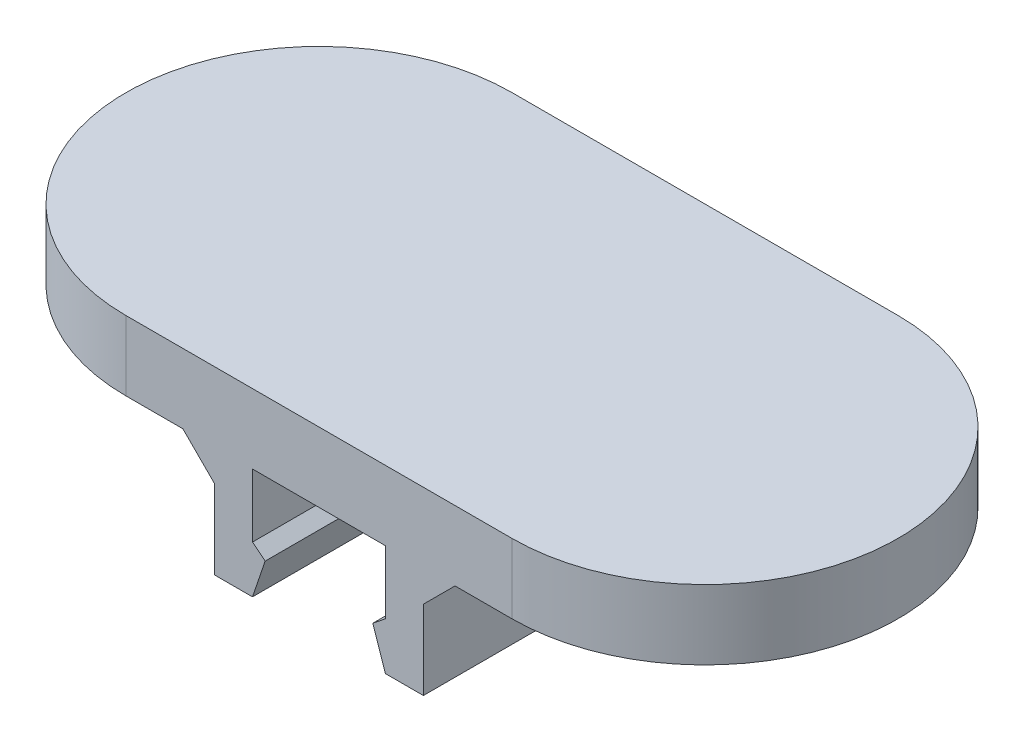
ISO-10303-21;
HEADER;
FILE_DESCRIPTION(('STEP AP214'),'2;1');
FILE_NAME('part.step','',(''),(''),'','','');
FILE_SCHEMA(('AUTOMOTIVE_DESIGN { 1 0 10303 214 1 1 1 1 }'));
ENDSEC;
DATA;
#1=APPLICATION_CONTEXT('core data for automotive mechanical design processes');
#2=APPLICATION_PROTOCOL_DEFINITION('international standard','automotive_design',2000,#1);
#3=PRODUCT_CONTEXT('',#1,'mechanical');
#4=PRODUCT('Part','Part','',(#3));
#5=PRODUCT_RELATED_PRODUCT_CATEGORY('part','',(#4));
#6=PRODUCT_DEFINITION_FORMATION('','',#4);
#7=PRODUCT_DEFINITION_CONTEXT('part definition',#1,'design');
#8=PRODUCT_DEFINITION('design','',#6,#7);
#9=PRODUCT_DEFINITION_SHAPE('','',#8);
#10=(LENGTH_UNIT() NAMED_UNIT(*) SI_UNIT(.MILLI.,.METRE.));
#11=(NAMED_UNIT(*) PLANE_ANGLE_UNIT() SI_UNIT($,.RADIAN.));
#12=(NAMED_UNIT(*) SI_UNIT($,.STERADIAN.) SOLID_ANGLE_UNIT());
#13=UNCERTAINTY_MEASURE_WITH_UNIT(LENGTH_MEASURE(1.E-05),#10,'distance_accuracy_value','');
#14=(GEOMETRIC_REPRESENTATION_CONTEXT(3) GLOBAL_UNCERTAINTY_ASSIGNED_CONTEXT((#13)) GLOBAL_UNIT_ASSIGNED_CONTEXT((#10,
#11,#12)) REPRESENTATION_CONTEXT('',''));
#15=CARTESIAN_POINT('',(0.,0.,0.));
#16=DIRECTION('',(0.,0.,1.));
#17=DIRECTION('',(1.,0.,0.));
#18=AXIS2_PLACEMENT_3D('',#15,#16,#17);
#19=CARTESIAN_POINT('',(-6.1,0.,0.));
#20=DIRECTION('',(0.,1.,0.));
#21=DIRECTION('',(0.,0.,1.));
#22=AXIS2_PLACEMENT_3D('',#19,#20,#21);
#23=PLANE('',#22);
#24=DIRECTION('',(1.,0.,0.));
#25=VECTOR('',#24,1.);
#26=CARTESIAN_POINT('',(-6.1,0.,6.1));
#27=LINE('',#26,#25);
#28=CARTESIAN_POINT('',(4.3,0.,6.1));
#29=VERTEX_POINT('',#28);
#30=CARTESIAN_POINT('',(6.1,0.,6.1));
#31=VERTEX_POINT('',#30);
#32=EDGE_CURVE('E240',#29,#31,#27,.T.);
#33=ORIENTED_EDGE('',*,*,#32,.F.);
#34=DIRECTION('',(0.,0.,-1.));
#35=VECTOR('',#34,1.);
#36=CARTESIAN_POINT('',(4.30000000000001,0.,-6.1));
#37=LINE('',#36,#35);
#38=CARTESIAN_POINT('',(4.30000000000001,0.,-6.1));
#39=VERTEX_POINT('',#38);
#40=EDGE_CURVE('E261',#29,#39,#37,.T.);
#41=ORIENTED_EDGE('',*,*,#40,.T.);
#42=DIRECTION('',(-1.,0.,0.));
#43=VECTOR('',#42,1.);
#44=CARTESIAN_POINT('',(-6.1,0.,-6.1));
#45=LINE('',#44,#43);
#46=CARTESIAN_POINT('',(6.1,0.,-6.1));
#47=VERTEX_POINT('',#46);
#48=EDGE_CURVE('E231',#47,#39,#45,.T.);
#49=ORIENTED_EDGE('',*,*,#48,.F.);
#50=CARTESIAN_POINT('',(6.1,0.,0.));
#51=DIRECTION('',(0.,1.,0.));
#52=DIRECTION('',(0.,0.,1.));
#53=AXIS2_PLACEMENT_3D('',#50,#51,#52);
#54=CIRCLE('',#53,6.1);
#55=EDGE_CURVE('E243',#31,#47,#54,.T.);
#56=ORIENTED_EDGE('',*,*,#55,.F.);
#57=EDGE_LOOP('',(#33,#41,#49,#56));
#58=FACE_BOUND('',#57,.T.);
#59=ADVANCED_FACE('F35',(#58),#23,.F.);
#60=DIRECTION('',(0.,0.,-1.));
#61=VECTOR('',#60,1.);
#62=CARTESIAN_POINT('',(2.1,0.,6.1));
#63=LINE('',#62,#61);
#64=CARTESIAN_POINT('',(2.1,0.,6.1));
#65=VERTEX_POINT('',#64);
#66=CARTESIAN_POINT('',(2.1,0.,-6.1));
#67=VERTEX_POINT('',#66);
#68=EDGE_CURVE('E189',#65,#67,#63,.T.);
#69=ORIENTED_EDGE('',*,*,#68,.F.);
#70=CARTESIAN_POINT('',(-2.1,0.,6.1));
#71=VERTEX_POINT('',#70);
#72=EDGE_CURVE('E244',#71,#65,#27,.T.);
#73=ORIENTED_EDGE('',*,*,#72,.F.);
#74=DIRECTION('',(0.,0.,-1.));
#75=VECTOR('',#74,1.);
#76=CARTESIAN_POINT('',(-2.1,0.,6.1));
#77=LINE('',#76,#75);
#78=CARTESIAN_POINT('',(-2.1,0.,-6.1));
#79=VERTEX_POINT('',#78);
#80=EDGE_CURVE('E203',#71,#79,#77,.T.);
#81=ORIENTED_EDGE('',*,*,#80,.T.);
#82=EDGE_CURVE('E249',#67,#79,#45,.T.);
#83=ORIENTED_EDGE('',*,*,#82,.F.);
#84=EDGE_LOOP('',(#69,#73,#81,#83));
#85=FACE_BOUND('',#84,.T.);
#86=ADVANCED_FACE('F311',(#85),#23,.F.);
#87=CARTESIAN_POINT('',(-4.3,0.,-6.1));
#88=VERTEX_POINT('',#87);
#89=CARTESIAN_POINT('',(-6.1,0.,-6.1));
#90=VERTEX_POINT('',#89);
#91=EDGE_CURVE('E246',#88,#90,#45,.T.);
#92=ORIENTED_EDGE('',*,*,#91,.F.);
#93=DIRECTION('',(0.,0.,1.));
#94=VECTOR('',#93,1.);
#95=CARTESIAN_POINT('',(-4.3,0.,6.1));
#96=LINE('',#95,#94);
#97=CARTESIAN_POINT('',(-4.3,0.,6.1));
#98=VERTEX_POINT('',#97);
#99=EDGE_CURVE('E57',#88,#98,#96,.T.);
#100=ORIENTED_EDGE('',*,*,#99,.T.);
#101=CARTESIAN_POINT('',(-6.1,0.,6.1));
#102=VERTEX_POINT('',#101);
#103=EDGE_CURVE('E241',#102,#98,#27,.T.);
#104=ORIENTED_EDGE('',*,*,#103,.F.);
#105=CARTESIAN_POINT('',(-6.1,0.,0.));
#106=DIRECTION('',(0.,1.,0.));
#107=DIRECTION('',(0.,0.,1.));
#108=AXIS2_PLACEMENT_3D('',#105,#106,#107);
#109=CIRCLE('',#108,6.1);
#110=EDGE_CURVE('E226',#90,#102,#109,.T.);
#111=ORIENTED_EDGE('',*,*,#110,.F.);
#112=EDGE_LOOP('',(#92,#100,#104,#111));
#113=FACE_BOUND('',#112,.T.);
#114=ADVANCED_FACE('F321',(#113),#23,.F.);
#115=CARTESIAN_POINT('',(-6.1,2.2,0.));
#116=DIRECTION('',(0.,-1.,0.));
#117=DIRECTION('',(0.,0.,-1.));
#118=AXIS2_PLACEMENT_3D('',#115,#116,#117);
#119=CYLINDRICAL_SURFACE('',#118,6.1);
#120=ORIENTED_EDGE('',*,*,#110,.T.);
#121=DIRECTION('',(0.,-1.,0.));
#122=VECTOR('',#121,1.);
#123=CARTESIAN_POINT('',(-6.1,2.2,6.1));
#124=LINE('',#123,#122);
#125=CARTESIAN_POINT('',(-6.1,2.2,6.1));
#126=VERTEX_POINT('',#125);
#127=EDGE_CURVE('E258',#126,#102,#124,.T.);
#128=ORIENTED_EDGE('',*,*,#127,.F.);
#129=CARTESIAN_POINT('',(-6.1,2.2,0.));
#130=DIRECTION('',(0.,1.,0.));
#131=DIRECTION('',(0.,0.,1.));
#132=AXIS2_PLACEMENT_3D('',#129,#130,#131);
#133=CIRCLE('',#132,6.1);
#134=CARTESIAN_POINT('',(-6.1,2.2,-6.1));
#135=VERTEX_POINT('',#134);
#136=EDGE_CURVE('E227',#135,#126,#133,.T.);
#137=ORIENTED_EDGE('',*,*,#136,.F.);
#138=DIRECTION('',(0.,-1.,0.));
#139=VECTOR('',#138,1.);
#140=CARTESIAN_POINT('',(-6.1,2.2,-6.1));
#141=LINE('',#140,#139);
#142=EDGE_CURVE('E237',#135,#90,#141,.T.);
#143=ORIENTED_EDGE('',*,*,#142,.T.);
#144=EDGE_LOOP('',(#120,#128,#137,#143));
#145=FACE_BOUND('',#144,.T.);
#146=ADVANCED_FACE('F319',(#145),#119,.T.);
#147=CARTESIAN_POINT('',(-6.1,2.2,6.1));
#148=DIRECTION('',(0.,0.,-1.));
#149=DIRECTION('',(-1.,0.,0.));
#150=AXIS2_PLACEMENT_3D('',#147,#148,#149);
#151=PLANE('',#150);
#152=ORIENTED_EDGE('',*,*,#103,.T.);
#153=DIRECTION('',(-0.707106781186544,0.707106781186551,0.));
#154=VECTOR('',#153,1.);
#155=CARTESIAN_POINT('',(-6.29999999999999,2.00000000000001,6.1));
#156=LINE('',#155,#154);
#157=CARTESIAN_POINT('',(-3.3,-1.00000000000001,6.1));
#158=VERTEX_POINT('',#157);
#159=EDGE_CURVE('E11',#98,#158,#156,.F.);
#160=ORIENTED_EDGE('',*,*,#159,.T.);
#161=DIRECTION('',(0.,-1.,0.));
#162=VECTOR('',#161,1.);
#163=CARTESIAN_POINT('',(-3.3,-3.5,6.1));
#164=LINE('',#163,#162);
#165=CARTESIAN_POINT('',(-3.3,-3.5,6.1));
#166=VERTEX_POINT('',#165);
#167=EDGE_CURVE('E193',#158,#166,#164,.T.);
#168=ORIENTED_EDGE('',*,*,#167,.T.);
#169=DIRECTION('',(1.,0.,0.));
#170=VECTOR('',#169,1.);
#171=CARTESIAN_POINT('',(-2.1,-3.5,6.1));
#172=LINE('',#171,#170);
#173=CARTESIAN_POINT('',(-2.1,-3.5,6.1));
#174=VERTEX_POINT('',#173);
#175=EDGE_CURVE('E195',#166,#174,#172,.T.);
#176=ORIENTED_EDGE('',*,*,#175,.T.);
#177=DIRECTION('',(0.321261594877715,0.946990489739272,0.));
#178=VECTOR('',#177,1.);
#179=CARTESIAN_POINT('',(-1.7,-2.32091042958343,6.1));
#180=LINE('',#179,#178);
#181=CARTESIAN_POINT('',(-1.7,-2.32091042958343,6.1));
#182=VERTEX_POINT('',#181);
#183=EDGE_CURVE('E198',#174,#182,#180,.T.);
#184=ORIENTED_EDGE('',*,*,#183,.T.);
#185=DIRECTION('',(-0.780002038437321,0.625776973077169,0.));
#186=VECTOR('',#185,1.);
#187=CARTESIAN_POINT('',(-2.1,-2.,6.1));
#188=LINE('',#187,#186);
#189=CARTESIAN_POINT('',(-2.1,-2.,6.1));
#190=VERTEX_POINT('',#189);
#191=EDGE_CURVE('E200',#182,#190,#188,.T.);
#192=ORIENTED_EDGE('',*,*,#191,.T.);
#193=DIRECTION('',(0.,1.,0.));
#194=VECTOR('',#193,1.);
#195=CARTESIAN_POINT('',(-2.1,0.,6.1));
#196=LINE('',#195,#194);
#197=EDGE_CURVE('E202',#190,#71,#196,.T.);
#198=ORIENTED_EDGE('',*,*,#197,.T.);
#199=ORIENTED_EDGE('',*,*,#72,.T.);
#200=DIRECTION('',(0.,-1.,0.));
#201=VECTOR('',#200,1.);
#202=CARTESIAN_POINT('',(2.1,0.,6.1));
#203=LINE('',#202,#201);
#204=CARTESIAN_POINT('',(2.1,-2.,6.1));
#205=VERTEX_POINT('',#204);
#206=EDGE_CURVE('E307',#65,#205,#203,.T.);
#207=ORIENTED_EDGE('',*,*,#206,.T.);
#208=DIRECTION('',(-0.780002038437321,-0.625776973077169,0.));
#209=VECTOR('',#208,1.);
#210=CARTESIAN_POINT('',(2.1,-2.,6.1));
#211=LINE('',#210,#209);
#212=CARTESIAN_POINT('',(1.7,-2.32091042958343,6.1));
#213=VERTEX_POINT('',#212);
#214=EDGE_CURVE('E176',#205,#213,#211,.T.);
#215=ORIENTED_EDGE('',*,*,#214,.T.);
#216=DIRECTION('',(0.321261594877715,-0.946990489739272,0.));
#217=VECTOR('',#216,1.);
#218=CARTESIAN_POINT('',(1.7,-2.32091042958343,6.1));
#219=LINE('',#218,#217);
#220=CARTESIAN_POINT('',(2.1,-3.5,6.1));
#221=VERTEX_POINT('',#220);
#222=EDGE_CURVE('E171',#213,#221,#219,.T.);
#223=ORIENTED_EDGE('',*,*,#222,.T.);
#224=DIRECTION('',(1.,0.,0.));
#225=VECTOR('',#224,1.);
#226=CARTESIAN_POINT('',(2.1,-3.5,6.1));
#227=LINE('',#226,#225);
#228=CARTESIAN_POINT('',(3.3,-3.5,6.1));
#229=VERTEX_POINT('',#228);
#230=EDGE_CURVE('E159',#221,#229,#227,.T.);
#231=ORIENTED_EDGE('',*,*,#230,.T.);
#232=DIRECTION('',(0.,1.,0.));
#233=VECTOR('',#232,1.);
#234=CARTESIAN_POINT('',(3.3,-3.5,6.1));
#235=LINE('',#234,#233);
#236=CARTESIAN_POINT('',(3.3,-0.999999999999997,6.1));
#237=VERTEX_POINT('',#236);
#238=EDGE_CURVE('E170',#229,#237,#235,.T.);
#239=ORIENTED_EDGE('',*,*,#238,.T.);
#240=DIRECTION('',(-0.707106781186551,-0.707106781186544,0.));
#241=VECTOR('',#240,1.);
#242=CARTESIAN_POINT('',(0.199999999999951,-4.10000000000002,6.1));
#243=LINE('',#242,#241);
#244=EDGE_CURVE('E272',#237,#29,#243,.F.);
#245=ORIENTED_EDGE('',*,*,#244,.T.);
#246=ORIENTED_EDGE('',*,*,#32,.T.);
#247=DIRECTION('',(0.,-1.,0.));
#248=VECTOR('',#247,1.);
#249=CARTESIAN_POINT('',(6.1,2.2,6.1));
#250=LINE('',#249,#248);
#251=CARTESIAN_POINT('',(6.1,2.2,6.1));
#252=VERTEX_POINT('',#251);
#253=EDGE_CURVE('E255',#252,#31,#250,.T.);
#254=ORIENTED_EDGE('',*,*,#253,.F.);
#255=DIRECTION('',(1.,0.,0.));
#256=VECTOR('',#255,1.);
#257=CARTESIAN_POINT('',(-6.1,2.2,6.1));
#258=LINE('',#257,#256);
#259=EDGE_CURVE('E230',#126,#252,#258,.T.);
#260=ORIENTED_EDGE('',*,*,#259,.F.);
#261=ORIENTED_EDGE('',*,*,#127,.T.);
#262=EDGE_LOOP('',(#152,#160,#168,#176,#184,#192,#198,#199,#207,#215,#223,#231,#239,#245,#246,
#254,#260,#261));
#263=FACE_BOUND('',#262,.T.);
#264=ADVANCED_FACE('F174',(#263),#151,.F.);
#265=CARTESIAN_POINT('',(6.1,2.2,0.));
#266=DIRECTION('',(0.,-1.,0.));
#267=DIRECTION('',(0.,0.,-1.));
#268=AXIS2_PLACEMENT_3D('',#265,#266,#267);
#269=CYLINDRICAL_SURFACE('',#268,6.1);
#270=ORIENTED_EDGE('',*,*,#55,.T.);
#271=DIRECTION('',(0.,-1.,0.));
#272=VECTOR('',#271,1.);
#273=CARTESIAN_POINT('',(6.1,2.2,-6.1));
#274=LINE('',#273,#272);
#275=CARTESIAN_POINT('',(6.1,2.2,-6.1));
#276=VERTEX_POINT('',#275);
#277=EDGE_CURVE('E252',#276,#47,#274,.T.);
#278=ORIENTED_EDGE('',*,*,#277,.F.);
#279=CARTESIAN_POINT('',(6.1,2.2,0.));
#280=DIRECTION('',(0.,1.,0.));
#281=DIRECTION('',(0.,0.,1.));
#282=AXIS2_PLACEMENT_3D('',#279,#280,#281);
#283=CIRCLE('',#282,6.1);
#284=EDGE_CURVE('E233',#252,#276,#283,.T.);
#285=ORIENTED_EDGE('',*,*,#284,.F.);
#286=ORIENTED_EDGE('',*,*,#253,.T.);
#287=EDGE_LOOP('',(#270,#278,#285,#286));
#288=FACE_BOUND('',#287,.T.);
#289=ADVANCED_FACE('F328',(#288),#269,.T.);
#290=CARTESIAN_POINT('',(-6.1,2.2,-6.1));
#291=DIRECTION('',(0.,0.,1.));
#292=DIRECTION('',(1.,0.,0.));
#293=AXIS2_PLACEMENT_3D('',#290,#291,#292);
#294=PLANE('',#293);
#295=ORIENTED_EDGE('',*,*,#48,.T.);
#296=DIRECTION('',(0.707106781186551,0.707106781186544,0.));
#297=VECTOR('',#296,1.);
#298=CARTESIAN_POINT('',(0.199999999999951,-4.10000000000002,-6.1));
#299=LINE('',#298,#297);
#300=CARTESIAN_POINT('',(3.3,-0.999999999999997,-6.1));
#301=VERTEX_POINT('',#300);
#302=EDGE_CURVE('E270',#39,#301,#299,.F.);
#303=ORIENTED_EDGE('',*,*,#302,.T.);
#304=DIRECTION('',(0.,1.,0.));
#305=VECTOR('',#304,1.);
#306=CARTESIAN_POINT('',(3.3,-3.5,-6.1));
#307=LINE('',#306,#305);
#308=CARTESIAN_POINT('',(3.3,-3.5,-6.1));
#309=VERTEX_POINT('',#308);
#310=EDGE_CURVE('E286',#309,#301,#307,.T.);
#311=ORIENTED_EDGE('',*,*,#310,.F.);
#312=DIRECTION('',(1.,0.,0.));
#313=VECTOR('',#312,1.);
#314=CARTESIAN_POINT('',(2.1,-3.5,-6.1));
#315=LINE('',#314,#313);
#316=CARTESIAN_POINT('',(2.1,-3.5,-6.1));
#317=VERTEX_POINT('',#316);
#318=EDGE_CURVE('E290',#317,#309,#315,.T.);
#319=ORIENTED_EDGE('',*,*,#318,.F.);
#320=DIRECTION('',(0.321261594877715,-0.946990489739272,0.));
#321=VECTOR('',#320,1.);
#322=CARTESIAN_POINT('',(1.7,-2.32091042958343,-6.1));
#323=LINE('',#322,#321);
#324=CARTESIAN_POINT('',(1.7,-2.32091042958343,-6.1));
#325=VERTEX_POINT('',#324);
#326=EDGE_CURVE('E184',#325,#317,#323,.T.);
#327=ORIENTED_EDGE('',*,*,#326,.F.);
#328=DIRECTION('',(-0.780002038437321,-0.625776973077169,0.));
#329=VECTOR('',#328,1.);
#330=CARTESIAN_POINT('',(2.1,-2.,-6.1));
#331=LINE('',#330,#329);
#332=CARTESIAN_POINT('',(2.1,-2.,-6.1));
#333=VERTEX_POINT('',#332);
#334=EDGE_CURVE('E180',#333,#325,#331,.T.);
#335=ORIENTED_EDGE('',*,*,#334,.F.);
#336=DIRECTION('',(0.,-1.,0.));
#337=VECTOR('',#336,1.);
#338=CARTESIAN_POINT('',(2.1,0.,-6.1));
#339=LINE('',#338,#337);
#340=EDGE_CURVE('E289',#67,#333,#339,.T.);
#341=ORIENTED_EDGE('',*,*,#340,.F.);
#342=ORIENTED_EDGE('',*,*,#82,.T.);
#343=DIRECTION('',(0.,1.,0.));
#344=VECTOR('',#343,1.);
#345=CARTESIAN_POINT('',(-2.1,0.,-6.1));
#346=LINE('',#345,#344);
#347=CARTESIAN_POINT('',(-2.1,-2.,-6.1));
#348=VERTEX_POINT('',#347);
#349=EDGE_CURVE('E196',#348,#79,#346,.T.);
#350=ORIENTED_EDGE('',*,*,#349,.F.);
#351=DIRECTION('',(-0.780002038437321,0.625776973077169,0.));
#352=VECTOR('',#351,1.);
#353=CARTESIAN_POINT('',(-2.1,-2.,-6.1));
#354=LINE('',#353,#352);
#355=CARTESIAN_POINT('',(-1.7,-2.32091042958343,-6.1));
#356=VERTEX_POINT('',#355);
#357=EDGE_CURVE('E208',#356,#348,#354,.T.);
#358=ORIENTED_EDGE('',*,*,#357,.F.);
#359=DIRECTION('',(0.321261594877715,0.946990489739272,0.));
#360=VECTOR('',#359,1.);
#361=CARTESIAN_POINT('',(-1.7,-2.32091042958343,-6.1));
#362=LINE('',#361,#360);
#363=CARTESIAN_POINT('',(-2.1,-3.5,-6.1));
#364=VERTEX_POINT('',#363);
#365=EDGE_CURVE('E206',#364,#356,#362,.T.);
#366=ORIENTED_EDGE('',*,*,#365,.F.);
#367=DIRECTION('',(1.,0.,0.));
#368=VECTOR('',#367,1.);
#369=CARTESIAN_POINT('',(-2.1,-3.5,-6.1));
#370=LINE('',#369,#368);
#371=CARTESIAN_POINT('',(-3.3,-3.5,-6.1));
#372=VERTEX_POINT('',#371);
#373=EDGE_CURVE('E187',#372,#364,#370,.T.);
#374=ORIENTED_EDGE('',*,*,#373,.F.);
#375=DIRECTION('',(0.,-1.,0.));
#376=VECTOR('',#375,1.);
#377=CARTESIAN_POINT('',(-3.3,-3.5,-6.1));
#378=LINE('',#377,#376);
#379=CARTESIAN_POINT('',(-3.3,-1.00000000000001,-6.1));
#380=VERTEX_POINT('',#379);
#381=EDGE_CURVE('E185',#380,#372,#378,.T.);
#382=ORIENTED_EDGE('',*,*,#381,.F.);
#383=DIRECTION('',(0.707106781186544,-0.707106781186551,0.));
#384=VECTOR('',#383,1.);
#385=CARTESIAN_POINT('',(-6.29999999999999,2.00000000000001,-6.1));
#386=LINE('',#385,#384);
#387=EDGE_CURVE('E44',#380,#88,#386,.F.);
#388=ORIENTED_EDGE('',*,*,#387,.T.);
#389=ORIENTED_EDGE('',*,*,#91,.T.);
#390=ORIENTED_EDGE('',*,*,#142,.F.);
#391=DIRECTION('',(-1.,0.,0.));
#392=VECTOR('',#391,1.);
#393=CARTESIAN_POINT('',(-6.1,2.2,-6.1));
#394=LINE('',#393,#392);
#395=EDGE_CURVE('E235',#276,#135,#394,.T.);
#396=ORIENTED_EDGE('',*,*,#395,.F.);
#397=ORIENTED_EDGE('',*,*,#277,.T.);
#398=EDGE_LOOP('',(#295,#303,#311,#319,#327,#335,#341,#342,#350,#358,#366,#374,#382,#388,#389,
#390,#396,#397));
#399=FACE_BOUND('',#398,.T.);
#400=ADVANCED_FACE('F285',(#399),#294,.F.);
#401=CARTESIAN_POINT('',(-6.1,2.2,0.));
#402=DIRECTION('',(0.,1.,0.));
#403=DIRECTION('',(0.,0.,1.));
#404=AXIS2_PLACEMENT_3D('',#401,#402,#403);
#405=PLANE('',#404);
#406=ORIENTED_EDGE('',*,*,#136,.T.);
#407=ORIENTED_EDGE('',*,*,#259,.T.);
#408=ORIENTED_EDGE('',*,*,#284,.T.);
#409=ORIENTED_EDGE('',*,*,#395,.T.);
#410=EDGE_LOOP('',(#406,#407,#408,#409));
#411=FACE_BOUND('',#410,.T.);
#412=ADVANCED_FACE('F325',(#411),#405,.T.);
#413=CARTESIAN_POINT('',(-3.3,-3.5,6.1));
#414=DIRECTION('',(1.,0.,0.));
#415=DIRECTION('',(0.,0.,-1.));
#416=AXIS2_PLACEMENT_3D('',#413,#414,#415);
#417=PLANE('',#416);
#418=ORIENTED_EDGE('',*,*,#167,.F.);
#419=DIRECTION('',(0.,0.,-1.));
#420=VECTOR('',#419,1.);
#421=CARTESIAN_POINT('',(-3.3,-1.00000000000001,-6.1));
#422=LINE('',#421,#420);
#423=EDGE_CURVE('E266',#158,#380,#422,.T.);
#424=ORIENTED_EDGE('',*,*,#423,.T.);
#425=ORIENTED_EDGE('',*,*,#381,.T.);
#426=DIRECTION('',(0.,0.,-1.));
#427=VECTOR('',#426,1.);
#428=CARTESIAN_POINT('',(-3.3,-3.5,6.1));
#429=LINE('',#428,#427);
#430=EDGE_CURVE('E223',#166,#372,#429,.T.);
#431=ORIENTED_EDGE('',*,*,#430,.F.);
#432=EDGE_LOOP('',(#418,#424,#425,#431));
#433=FACE_BOUND('',#432,.T.);
#434=ADVANCED_FACE('F388',(#433),#417,.F.);
#435=CARTESIAN_POINT('',(-2.1,-3.5,6.1));
#436=DIRECTION('',(0.,1.,0.));
#437=DIRECTION('',(-1.,0.,0.));
#438=AXIS2_PLACEMENT_3D('',#435,#436,#437);
#439=PLANE('',#438);
#440=ORIENTED_EDGE('',*,*,#373,.T.);
#441=DIRECTION('',(0.,0.,-1.));
#442=VECTOR('',#441,1.);
#443=CARTESIAN_POINT('',(-2.1,-3.5,6.1));
#444=LINE('',#443,#442);
#445=EDGE_CURVE('E220',#174,#364,#444,.T.);
#446=ORIENTED_EDGE('',*,*,#445,.F.);
#447=ORIENTED_EDGE('',*,*,#175,.F.);
#448=ORIENTED_EDGE('',*,*,#430,.T.);
#449=EDGE_LOOP('',(#440,#446,#447,#448));
#450=FACE_BOUND('',#449,.T.);
#451=ADVANCED_FACE('F384',(#450),#439,.F.);
#452=CARTESIAN_POINT('',(-1.7,-2.32091042958343,6.1));
#453=DIRECTION('',(-0.946990489739272,0.321261594877715,0.));
#454=DIRECTION('',(-0.321261594877715,-0.946990489739272,0.));
#455=AXIS2_PLACEMENT_3D('',#452,#453,#454);
#456=PLANE('',#455);
#457=ORIENTED_EDGE('',*,*,#365,.T.);
#458=DIRECTION('',(0.,0.,-1.));
#459=VECTOR('',#458,1.);
#460=CARTESIAN_POINT('',(-1.7,-2.32091042958343,6.1));
#461=LINE('',#460,#459);
#462=EDGE_CURVE('E217',#182,#356,#461,.T.);
#463=ORIENTED_EDGE('',*,*,#462,.F.);
#464=ORIENTED_EDGE('',*,*,#183,.F.);
#465=ORIENTED_EDGE('',*,*,#445,.T.);
#466=EDGE_LOOP('',(#457,#463,#464,#465));
#467=FACE_BOUND('',#466,.T.);
#468=ADVANCED_FACE('F380',(#467),#456,.F.);
#469=CARTESIAN_POINT('',(-2.1,-2.,6.1));
#470=DIRECTION('',(-0.625776973077169,-0.780002038437321,0.));
#471=DIRECTION('',(0.780002038437321,-0.625776973077169,0.));
#472=AXIS2_PLACEMENT_3D('',#469,#470,#471);
#473=PLANE('',#472);
#474=ORIENTED_EDGE('',*,*,#357,.T.);
#475=DIRECTION('',(0.,0.,-1.));
#476=VECTOR('',#475,1.);
#477=CARTESIAN_POINT('',(-2.1,-2.,6.1));
#478=LINE('',#477,#476);
#479=EDGE_CURVE('E214',#190,#348,#478,.T.);
#480=ORIENTED_EDGE('',*,*,#479,.F.);
#481=ORIENTED_EDGE('',*,*,#191,.F.);
#482=ORIENTED_EDGE('',*,*,#462,.T.);
#483=EDGE_LOOP('',(#474,#480,#481,#482));
#484=FACE_BOUND('',#483,.T.);
#485=ADVANCED_FACE('F376',(#484),#473,.F.);
#486=CARTESIAN_POINT('',(-2.1,0.,6.1));
#487=DIRECTION('',(-1.,0.,0.));
#488=DIRECTION('',(0.,-1.,0.));
#489=AXIS2_PLACEMENT_3D('',#486,#487,#488);
#490=PLANE('',#489);
#491=ORIENTED_EDGE('',*,*,#349,.T.);
#492=ORIENTED_EDGE('',*,*,#80,.F.);
#493=ORIENTED_EDGE('',*,*,#197,.F.);
#494=ORIENTED_EDGE('',*,*,#479,.T.);
#495=EDGE_LOOP('',(#491,#492,#493,#494));
#496=FACE_BOUND('',#495,.T.);
#497=ADVANCED_FACE('F373',(#496),#490,.F.);
#498=CARTESIAN_POINT('',(1.7,-2.32091042958343,6.1));
#499=DIRECTION('',(0.946990489739272,0.321261594877715,0.));
#500=DIRECTION('',(-0.321261594877715,0.946990489739272,0.));
#501=AXIS2_PLACEMENT_3D('',#498,#499,#500);
#502=PLANE('',#501);
#503=ORIENTED_EDGE('',*,*,#326,.T.);
#504=DIRECTION('',(0.,0.,-1.));
#505=VECTOR('',#504,1.);
#506=CARTESIAN_POINT('',(2.1,-3.5,6.1));
#507=LINE('',#506,#505);
#508=EDGE_CURVE('E163',#221,#317,#507,.T.);
#509=ORIENTED_EDGE('',*,*,#508,.F.);
#510=ORIENTED_EDGE('',*,*,#222,.F.);
#511=DIRECTION('',(0.,0.,-1.));
#512=VECTOR('',#511,1.);
#513=CARTESIAN_POINT('',(1.7,-2.32091042958343,6.1));
#514=LINE('',#513,#512);
#515=EDGE_CURVE('E297',#213,#325,#514,.T.);
#516=ORIENTED_EDGE('',*,*,#515,.T.);
#517=EDGE_LOOP('',(#503,#509,#510,#516));
#518=FACE_BOUND('',#517,.T.);
#519=ADVANCED_FACE('F182',(#518),#502,.F.);
#520=CARTESIAN_POINT('',(2.1,-3.5,6.1));
#521=DIRECTION('',(0.,1.,0.));
#522=DIRECTION('',(-1.,0.,0.));
#523=AXIS2_PLACEMENT_3D('',#520,#521,#522);
#524=PLANE('',#523);
#525=ORIENTED_EDGE('',*,*,#318,.T.);
#526=DIRECTION('',(0.,0.,-1.));
#527=VECTOR('',#526,1.);
#528=CARTESIAN_POINT('',(3.3,-3.5,6.1));
#529=LINE('',#528,#527);
#530=EDGE_CURVE('E166',#229,#309,#529,.T.);
#531=ORIENTED_EDGE('',*,*,#530,.F.);
#532=ORIENTED_EDGE('',*,*,#230,.F.);
#533=ORIENTED_EDGE('',*,*,#508,.T.);
#534=EDGE_LOOP('',(#525,#531,#532,#533));
#535=FACE_BOUND('',#534,.T.);
#536=ADVANCED_FACE('F161',(#535),#524,.F.);
#537=CARTESIAN_POINT('',(3.3,-3.5,6.1));
#538=DIRECTION('',(-1.,0.,0.));
#539=DIRECTION('',(0.,0.,1.));
#540=AXIS2_PLACEMENT_3D('',#537,#538,#539);
#541=PLANE('',#540);
#542=ORIENTED_EDGE('',*,*,#310,.T.);
#543=DIRECTION('',(0.,0.,1.));
#544=VECTOR('',#543,1.);
#545=CARTESIAN_POINT('',(3.3,-0.999999999999997,6.1));
#546=LINE('',#545,#544);
#547=EDGE_CURVE('E264',#301,#237,#546,.T.);
#548=ORIENTED_EDGE('',*,*,#547,.T.);
#549=ORIENTED_EDGE('',*,*,#238,.F.);
#550=ORIENTED_EDGE('',*,*,#530,.T.);
#551=EDGE_LOOP('',(#542,#548,#549,#550));
#552=FACE_BOUND('',#551,.T.);
#553=ADVANCED_FACE('F288',(#552),#541,.F.);
#554=CARTESIAN_POINT('',(2.1,0.,6.1));
#555=DIRECTION('',(1.,0.,0.));
#556=DIRECTION('',(0.,1.,0.));
#557=AXIS2_PLACEMENT_3D('',#554,#555,#556);
#558=PLANE('',#557);
#559=ORIENTED_EDGE('',*,*,#340,.T.);
#560=DIRECTION('',(0.,0.,-1.));
#561=VECTOR('',#560,1.);
#562=CARTESIAN_POINT('',(2.1,-2.,6.1));
#563=LINE('',#562,#561);
#564=EDGE_CURVE('E299',#205,#333,#563,.T.);
#565=ORIENTED_EDGE('',*,*,#564,.F.);
#566=ORIENTED_EDGE('',*,*,#206,.F.);
#567=ORIENTED_EDGE('',*,*,#68,.T.);
#568=EDGE_LOOP('',(#559,#565,#566,#567));
#569=FACE_BOUND('',#568,.T.);
#570=ADVANCED_FACE('F305',(#569),#558,.F.);
#571=CARTESIAN_POINT('',(2.1,-2.,6.1));
#572=DIRECTION('',(0.625776973077169,-0.780002038437321,0.));
#573=DIRECTION('',(0.780002038437321,0.625776973077169,0.));
#574=AXIS2_PLACEMENT_3D('',#571,#572,#573);
#575=PLANE('',#574);
#576=ORIENTED_EDGE('',*,*,#334,.T.);
#577=ORIENTED_EDGE('',*,*,#515,.F.);
#578=ORIENTED_EDGE('',*,*,#214,.F.);
#579=ORIENTED_EDGE('',*,*,#564,.T.);
#580=EDGE_LOOP('',(#576,#577,#578,#579));
#581=FACE_BOUND('',#580,.T.);
#582=ADVANCED_FACE('F354',(#581),#575,.F.);
#583=CARTESIAN_POINT('',(4.30000000000001,0.,0.));
#584=DIRECTION('',(0.707106781186544,-0.707106781186551,0.));
#585=DIRECTION('',(0.,0.,1.));
#586=AXIS2_PLACEMENT_3D('',#583,#584,#585);
#587=PLANE('',#586);
#588=ORIENTED_EDGE('',*,*,#244,.F.);
#589=ORIENTED_EDGE('',*,*,#547,.F.);
#590=ORIENTED_EDGE('',*,*,#302,.F.);
#591=ORIENTED_EDGE('',*,*,#40,.F.);
#592=EDGE_LOOP('',(#588,#589,#590,#591));
#593=FACE_BOUND('',#592,.T.);
#594=ADVANCED_FACE('F282',(#593),#587,.T.);
#595=CARTESIAN_POINT('',(-3.3,-1.00000000000001,6.1));
#596=DIRECTION('',(-0.707106781186551,-0.707106781186544,0.));
#597=DIRECTION('',(0.,0.,1.));
#598=AXIS2_PLACEMENT_3D('',#595,#596,#597);
#599=PLANE('',#598);
#600=ORIENTED_EDGE('',*,*,#159,.F.);
#601=ORIENTED_EDGE('',*,*,#99,.F.);
#602=ORIENTED_EDGE('',*,*,#387,.F.);
#603=ORIENTED_EDGE('',*,*,#423,.F.);
#604=EDGE_LOOP('',(#600,#601,#602,#603));
#605=FACE_BOUND('',#604,.T.);
#606=ADVANCED_FACE('F38',(#605),#599,.T.);
#607=CLOSED_SHELL('',(#59,#86,#114,#146,#264,#289,#400,#412,#434,#451,#468,#485,#497,#519,#536,
#553,#570,#582,#594,#606));
#608=MANIFOLD_SOLID_BREP('B2',#607);
#609=ADVANCED_BREP_SHAPE_REPRESENTATION('',(#18,#608),#14);
#610=SHAPE_DEFINITION_REPRESENTATION(#9,#609);
ENDSEC;
END-ISO-10303-21;
